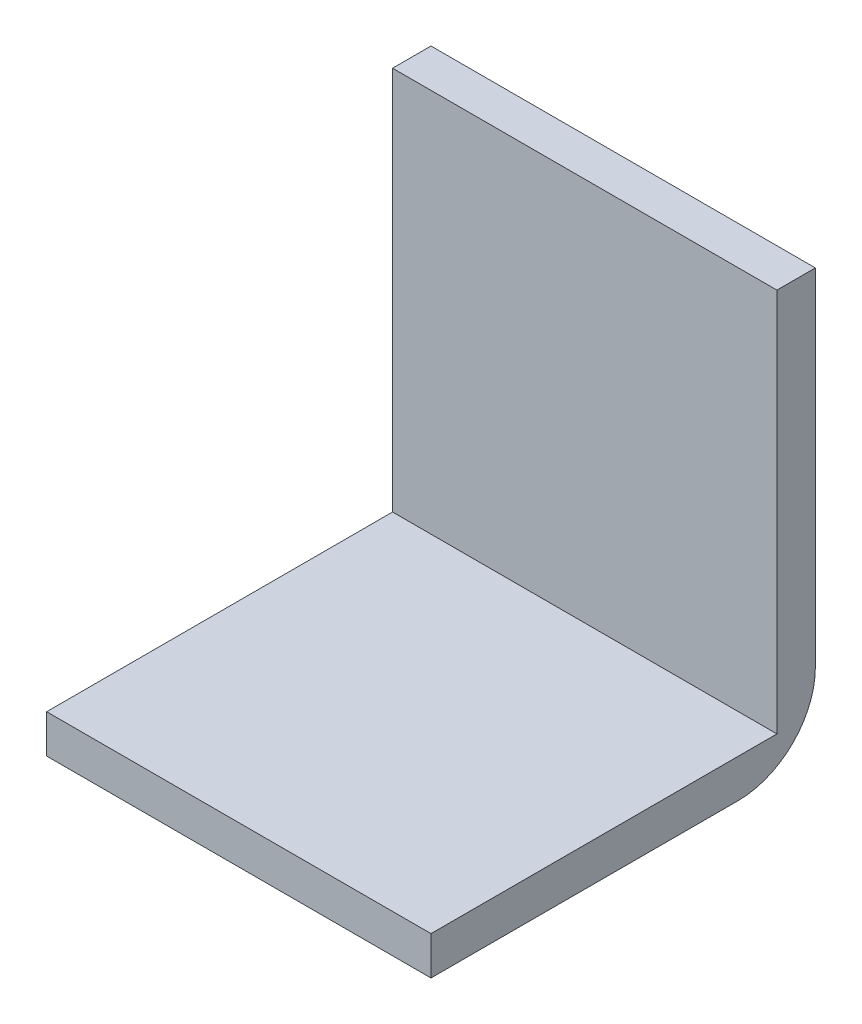
ISO-10303-21;
HEADER;
FILE_DESCRIPTION(('STEP AP214'),'2;1');
FILE_NAME('part.step','',(''),(''),'','','');
FILE_SCHEMA(('AUTOMOTIVE_DESIGN { 1 0 10303 214 1 1 1 1 }'));
ENDSEC;
DATA;
#1=APPLICATION_CONTEXT('core data for automotive mechanical design processes');
#2=APPLICATION_PROTOCOL_DEFINITION('international standard','automotive_design',2000,#1);
#3=PRODUCT_CONTEXT('',#1,'mechanical');
#4=PRODUCT('Part','Part','',(#3));
#5=PRODUCT_RELATED_PRODUCT_CATEGORY('part','',(#4));
#6=PRODUCT_DEFINITION_FORMATION('','',#4);
#7=PRODUCT_DEFINITION_CONTEXT('part definition',#1,'design');
#8=PRODUCT_DEFINITION('design','',#6,#7);
#9=PRODUCT_DEFINITION_SHAPE('','',#8);
#10=(LENGTH_UNIT() NAMED_UNIT(*) SI_UNIT(.MILLI.,.METRE.));
#11=(NAMED_UNIT(*) PLANE_ANGLE_UNIT() SI_UNIT($,.RADIAN.));
#12=(NAMED_UNIT(*) SI_UNIT($,.STERADIAN.) SOLID_ANGLE_UNIT());
#13=UNCERTAINTY_MEASURE_WITH_UNIT(LENGTH_MEASURE(1.E-05),#10,'distance_accuracy_value','');
#14=(GEOMETRIC_REPRESENTATION_CONTEXT(3) GLOBAL_UNCERTAINTY_ASSIGNED_CONTEXT((#13)) GLOBAL_UNIT_ASSIGNED_CONTEXT((#10,
#11,#12)) REPRESENTATION_CONTEXT('',''));
#15=CARTESIAN_POINT('',(0.,0.,0.));
#16=DIRECTION('',(0.,0.,1.));
#17=DIRECTION('',(1.,0.,0.));
#18=AXIS2_PLACEMENT_3D('',#15,#16,#17);
#19=CARTESIAN_POINT('',(0.,-17.1019108280255,10.));
#20=DIRECTION('',(-1.,0.,0.));
#21=DIRECTION('',(0.,0.,1.));
#22=AXIS2_PLACEMENT_3D('',#19,#20,#21);
#23=CYLINDRICAL_SURFACE('',#22,10.);
#24=DIRECTION('',(-1.,0.,0.));
#25=VECTOR('',#24,1.);
#26=CARTESIAN_POINT('',(0.,-17.1019108280255,0.));
#27=LINE('',#26,#25);
#28=CARTESIAN_POINT('',(34.5859872611465,-17.1019108280255,0.));
#29=VERTEX_POINT('',#28);
#30=CARTESIAN_POINT('',(-15.4140127388535,-17.1019108280255,0.));
#31=VERTEX_POINT('',#30);
#32=EDGE_CURVE('E168',#29,#31,#27,.T.);
#33=ORIENTED_EDGE('',*,*,#32,.F.);
#34=CARTESIAN_POINT('',(34.5859872611465,-17.1019108280255,10.));
#35=DIRECTION('',(-1.,0.,0.));
#36=DIRECTION('',(0.,-1.,0.));
#37=AXIS2_PLACEMENT_3D('',#34,#35,#36);
#38=CIRCLE('',#37,10.);
#39=CARTESIAN_POINT('',(34.5859872611465,-27.1019108280255,9.99999999999999));
#40=VERTEX_POINT('',#39);
#41=EDGE_CURVE('E53',#40,#29,#38,.F.);
#42=ORIENTED_EDGE('',*,*,#41,.F.);
#43=DIRECTION('',(-1.,0.,0.));
#44=VECTOR('',#43,1.);
#45=CARTESIAN_POINT('',(-15.4140127388535,-27.1019108280255,10.));
#46=LINE('',#45,#44);
#47=CARTESIAN_POINT('',(-15.4140127388535,-27.1019108280255,9.99999999999999));
#48=VERTEX_POINT('',#47);
#49=EDGE_CURVE('E172',#48,#40,#46,.F.);
#50=ORIENTED_EDGE('',*,*,#49,.F.);
#51=CARTESIAN_POINT('',(-15.4140127388535,-17.1019108280255,10.));
#52=DIRECTION('',(1.,0.,0.));
#53=DIRECTION('',(0.,1.,0.));
#54=AXIS2_PLACEMENT_3D('',#51,#52,#53);
#55=CIRCLE('',#54,10.);
#56=EDGE_CURVE('E11',#31,#48,#55,.F.);
#57=ORIENTED_EDGE('',*,*,#56,.F.);
#58=EDGE_LOOP('',(#33,#42,#50,#57));
#59=FACE_BOUND('',#58,.T.);
#60=ADVANCED_FACE('F45',(#59),#23,.T.);
#61=CARTESIAN_POINT('',(-15.4140127388535,27.8980891719745,50.));
#62=DIRECTION('',(0.,-1.,0.));
#63=DIRECTION('',(0.,0.,-1.));
#64=AXIS2_PLACEMENT_3D('',#61,#62,#63);
#65=PLANE('',#64);
#66=DIRECTION('',(-1.,0.,0.));
#67=VECTOR('',#66,1.);
#68=CARTESIAN_POINT('',(-15.4140127388535,27.8980891719745,5.));
#69=LINE('',#68,#67);
#70=CARTESIAN_POINT('',(34.5859872611465,27.8980891719745,5.));
#71=VERTEX_POINT('',#70);
#72=CARTESIAN_POINT('',(-15.4140127388535,27.8980891719745,5.));
#73=VERTEX_POINT('',#72);
#74=EDGE_CURVE('E118',#71,#73,#69,.T.);
#75=ORIENTED_EDGE('',*,*,#74,.F.);
#76=DIRECTION('',(0.,0.,-1.));
#77=VECTOR('',#76,1.);
#78=CARTESIAN_POINT('',(34.5859872611465,27.8980891719745,50.));
#79=LINE('',#78,#77);
#80=CARTESIAN_POINT('',(34.5859872611465,27.8980891719745,0.));
#81=VERTEX_POINT('',#80);
#82=EDGE_CURVE('E156',#71,#81,#79,.T.);
#83=ORIENTED_EDGE('',*,*,#82,.T.);
#84=DIRECTION('',(-1.,0.,0.));
#85=VECTOR('',#84,1.);
#86=CARTESIAN_POINT('',(-15.4140127388535,27.8980891719745,0.));
#87=LINE('',#86,#85);
#88=CARTESIAN_POINT('',(-15.4140127388535,27.8980891719745,0.));
#89=VERTEX_POINT('',#88);
#90=EDGE_CURVE('E138',#81,#89,#87,.T.);
#91=ORIENTED_EDGE('',*,*,#90,.T.);
#92=DIRECTION('',(0.,0.,-1.));
#93=VECTOR('',#92,1.);
#94=CARTESIAN_POINT('',(-15.4140127388535,27.8980891719745,50.));
#95=LINE('',#94,#93);
#96=EDGE_CURVE('E145',#73,#89,#95,.T.);
#97=ORIENTED_EDGE('',*,*,#96,.F.);
#98=EDGE_LOOP('',(#75,#83,#91,#97));
#99=FACE_BOUND('',#98,.T.);
#100=ADVANCED_FACE('F186',(#99),#65,.F.);
#101=CARTESIAN_POINT('',(-15.4140127388535,27.8980891719745,50.));
#102=DIRECTION('',(1.,0.,0.));
#103=DIRECTION('',(0.,1.,0.));
#104=AXIS2_PLACEMENT_3D('',#101,#102,#103);
#105=PLANE('',#104);
#106=DIRECTION('',(0.,-1.,0.));
#107=VECTOR('',#106,1.);
#108=CARTESIAN_POINT('',(-15.4140127388535,27.8980891719745,0.));
#109=LINE('',#108,#107);
#110=EDGE_CURVE('E130',#89,#31,#109,.T.);
#111=ORIENTED_EDGE('',*,*,#110,.T.);
#112=ORIENTED_EDGE('',*,*,#56,.T.);
#113=DIRECTION('',(0.,0.,-1.));
#114=VECTOR('',#113,1.);
#115=CARTESIAN_POINT('',(-15.4140127388535,-27.1019108280255,50.));
#116=LINE('',#115,#114);
#117=CARTESIAN_POINT('',(-15.4140127388535,-27.1019108280255,50.));
#118=VERTEX_POINT('',#117);
#119=EDGE_CURVE('E164',#118,#48,#116,.T.);
#120=ORIENTED_EDGE('',*,*,#119,.F.);
#121=DIRECTION('',(0.,-1.,0.));
#122=VECTOR('',#121,1.);
#123=CARTESIAN_POINT('',(-15.4140127388535,27.8980891719745,50.));
#124=LINE('',#123,#122);
#125=CARTESIAN_POINT('',(-15.4140127388535,-22.1019108280255,50.));
#126=VERTEX_POINT('',#125);
#127=EDGE_CURVE('E125',#126,#118,#124,.T.);
#128=ORIENTED_EDGE('',*,*,#127,.F.);
#129=DIRECTION('',(0.,0.,1.));
#130=VECTOR('',#129,1.);
#131=CARTESIAN_POINT('',(-15.4140127388535,-22.1019108280255,5.));
#132=LINE('',#131,#130);
#133=CARTESIAN_POINT('',(-15.4140127388535,-22.1019108280255,5.));
#134=VERTEX_POINT('',#133);
#135=EDGE_CURVE('E105',#134,#126,#132,.T.);
#136=ORIENTED_EDGE('',*,*,#135,.F.);
#137=DIRECTION('',(0.,-1.,0.));
#138=VECTOR('',#137,1.);
#139=CARTESIAN_POINT('',(-15.4140127388535,27.8980891719745,5.));
#140=LINE('',#139,#138);
#141=EDGE_CURVE('E113',#73,#134,#140,.T.);
#142=ORIENTED_EDGE('',*,*,#141,.F.);
#143=ORIENTED_EDGE('',*,*,#96,.T.);
#144=EDGE_LOOP('',(#111,#112,#120,#128,#136,#142,#143));
#145=FACE_BOUND('',#144,.T.);
#146=ADVANCED_FACE('F124',(#145),#105,.F.);
#147=CARTESIAN_POINT('',(-15.4140127388535,-27.1019108280255,50.));
#148=DIRECTION('',(0.,1.,0.));
#149=DIRECTION('',(0.,0.,1.));
#150=AXIS2_PLACEMENT_3D('',#147,#148,#149);
#151=PLANE('',#150);
#152=ORIENTED_EDGE('',*,*,#119,.T.);
#153=ORIENTED_EDGE('',*,*,#49,.T.);
#154=DIRECTION('',(0.,0.,-1.));
#155=VECTOR('',#154,1.);
#156=CARTESIAN_POINT('',(34.5859872611465,-27.1019108280255,50.));
#157=LINE('',#156,#155);
#158=CARTESIAN_POINT('',(34.5859872611465,-27.1019108280255,50.));
#159=VERTEX_POINT('',#158);
#160=EDGE_CURVE('E160',#159,#40,#157,.T.);
#161=ORIENTED_EDGE('',*,*,#160,.F.);
#162=DIRECTION('',(1.,0.,0.));
#163=VECTOR('',#162,1.);
#164=CARTESIAN_POINT('',(-15.4140127388535,-27.1019108280255,50.));
#165=LINE('',#164,#163);
#166=EDGE_CURVE('E137',#118,#159,#165,.T.);
#167=ORIENTED_EDGE('',*,*,#166,.F.);
#168=EDGE_LOOP('',(#152,#153,#161,#167));
#169=FACE_BOUND('',#168,.T.);
#170=ADVANCED_FACE('F194',(#169),#151,.F.);
#171=CARTESIAN_POINT('',(34.5859872611465,27.8980891719745,50.));
#172=DIRECTION('',(-1.,0.,0.));
#173=DIRECTION('',(0.,-1.,0.));
#174=AXIS2_PLACEMENT_3D('',#171,#172,#173);
#175=PLANE('',#174);
#176=ORIENTED_EDGE('',*,*,#160,.T.);
#177=ORIENTED_EDGE('',*,*,#41,.T.);
#178=DIRECTION('',(0.,1.,0.));
#179=VECTOR('',#178,1.);
#180=CARTESIAN_POINT('',(34.5859872611465,27.8980891719745,0.));
#181=LINE('',#180,#179);
#182=EDGE_CURVE('E148',#29,#81,#181,.T.);
#183=ORIENTED_EDGE('',*,*,#182,.T.);
#184=ORIENTED_EDGE('',*,*,#82,.F.);
#185=DIRECTION('',(0.,1.,0.));
#186=VECTOR('',#185,1.);
#187=CARTESIAN_POINT('',(34.5859872611465,27.8980891719745,5.));
#188=LINE('',#187,#186);
#189=CARTESIAN_POINT('',(34.5859872611465,-22.1019108280255,5.));
#190=VERTEX_POINT('',#189);
#191=EDGE_CURVE('E112',#190,#71,#188,.T.);
#192=ORIENTED_EDGE('',*,*,#191,.F.);
#193=DIRECTION('',(0.,0.,1.));
#194=VECTOR('',#193,1.);
#195=CARTESIAN_POINT('',(34.5859872611465,-22.1019108280255,5.));
#196=LINE('',#195,#194);
#197=CARTESIAN_POINT('',(34.5859872611465,-22.1019108280255,50.));
#198=VERTEX_POINT('',#197);
#199=EDGE_CURVE('E108',#190,#198,#196,.T.);
#200=ORIENTED_EDGE('',*,*,#199,.T.);
#201=DIRECTION('',(0.,1.,0.));
#202=VECTOR('',#201,1.);
#203=CARTESIAN_POINT('',(34.5859872611465,27.8980891719745,50.));
#204=LINE('',#203,#202);
#205=EDGE_CURVE('E141',#159,#198,#204,.T.);
#206=ORIENTED_EDGE('',*,*,#205,.F.);
#207=EDGE_LOOP('',(#176,#177,#183,#184,#192,#200,#206));
#208=FACE_BOUND('',#207,.T.);
#209=ADVANCED_FACE('F176',(#208),#175,.F.);
#210=CARTESIAN_POINT('',(0.,0.,50.));
#211=DIRECTION('',(0.,0.,1.));
#212=DIRECTION('',(1.,0.,0.));
#213=AXIS2_PLACEMENT_3D('',#210,#211,#212);
#214=PLANE('',#213);
#215=DIRECTION('',(1.,0.,0.));
#216=VECTOR('',#215,1.);
#217=CARTESIAN_POINT('',(-15.4140127388535,-22.1019108280255,50.));
#218=LINE('',#217,#216);
#219=EDGE_CURVE('E121',#126,#198,#218,.T.);
#220=ORIENTED_EDGE('',*,*,#219,.F.);
#221=ORIENTED_EDGE('',*,*,#127,.T.);
#222=ORIENTED_EDGE('',*,*,#166,.T.);
#223=ORIENTED_EDGE('',*,*,#205,.T.);
#224=EDGE_LOOP('',(#220,#221,#222,#223));
#225=FACE_BOUND('',#224,.T.);
#226=ADVANCED_FACE('F191',(#225),#214,.T.);
#227=CARTESIAN_POINT('',(0.,0.,0.));
#228=DIRECTION('',(0.,0.,1.));
#229=DIRECTION('',(1.,0.,0.));
#230=AXIS2_PLACEMENT_3D('',#227,#228,#229);
#231=PLANE('',#230);
#232=ORIENTED_EDGE('',*,*,#182,.F.);
#233=ORIENTED_EDGE('',*,*,#32,.T.);
#234=ORIENTED_EDGE('',*,*,#110,.F.);
#235=ORIENTED_EDGE('',*,*,#90,.F.);
#236=EDGE_LOOP('',(#232,#233,#234,#235));
#237=FACE_BOUND('',#236,.T.);
#238=ADVANCED_FACE('F184',(#237),#231,.F.);
#239=CARTESIAN_POINT('',(-15.4140127388535,-22.1019108280255,5.));
#240=DIRECTION('',(0.,-1.,0.));
#241=DIRECTION('',(0.,0.,-1.));
#242=AXIS2_PLACEMENT_3D('',#239,#240,#241);
#243=PLANE('',#242);
#244=ORIENTED_EDGE('',*,*,#219,.T.);
#245=ORIENTED_EDGE('',*,*,#199,.F.);
#246=DIRECTION('',(1.,0.,0.));
#247=VECTOR('',#246,1.);
#248=CARTESIAN_POINT('',(-15.4140127388535,-22.1019108280255,5.));
#249=LINE('',#248,#247);
#250=EDGE_CURVE('E101',#134,#190,#249,.T.);
#251=ORIENTED_EDGE('',*,*,#250,.F.);
#252=ORIENTED_EDGE('',*,*,#135,.T.);
#253=EDGE_LOOP('',(#244,#245,#251,#252));
#254=FACE_BOUND('',#253,.T.);
#255=ADVANCED_FACE('F103',(#254),#243,.F.);
#256=CARTESIAN_POINT('',(0.,0.,5.));
#257=DIRECTION('',(0.,0.,1.));
#258=DIRECTION('',(1.,0.,0.));
#259=AXIS2_PLACEMENT_3D('',#256,#257,#258);
#260=PLANE('',#259);
#261=ORIENTED_EDGE('',*,*,#141,.T.);
#262=ORIENTED_EDGE('',*,*,#250,.T.);
#263=ORIENTED_EDGE('',*,*,#191,.T.);
#264=ORIENTED_EDGE('',*,*,#74,.T.);
#265=EDGE_LOOP('',(#261,#262,#263,#264));
#266=FACE_BOUND('',#265,.T.);
#267=ADVANCED_FACE('F116',(#266),#260,.T.);
#268=CLOSED_SHELL('',(#60,#100,#146,#170,#209,#226,#238,#255,#267));
#269=MANIFOLD_SOLID_BREP('B2',#268);
#270=ADVANCED_BREP_SHAPE_REPRESENTATION('',(#18,#269),#14);
#271=SHAPE_DEFINITION_REPRESENTATION(#9,#270);
ENDSEC;
END-ISO-10303-21;
